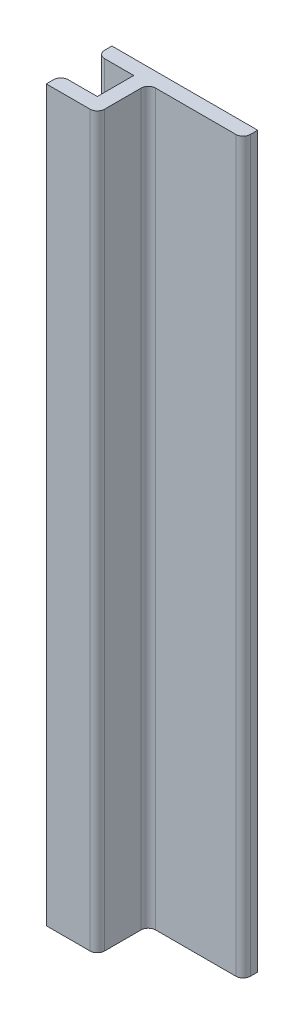
ISO-10303-21;
HEADER;
FILE_DESCRIPTION(('STEP AP214'),'2;1');
FILE_NAME('part.step','',(''),(''),'','','');
FILE_SCHEMA(('AUTOMOTIVE_DESIGN { 1 0 10303 214 1 1 1 1 }'));
ENDSEC;
DATA;
#1=APPLICATION_CONTEXT('core data for automotive mechanical design processes');
#2=APPLICATION_PROTOCOL_DEFINITION('international standard','automotive_design',2000,#1);
#3=PRODUCT_CONTEXT('',#1,'mechanical');
#4=PRODUCT('Part','Part','',(#3));
#5=PRODUCT_RELATED_PRODUCT_CATEGORY('part','',(#4));
#6=PRODUCT_DEFINITION_FORMATION('','',#4);
#7=PRODUCT_DEFINITION_CONTEXT('part definition',#1,'design');
#8=PRODUCT_DEFINITION('design','',#6,#7);
#9=PRODUCT_DEFINITION_SHAPE('','',#8);
#10=(LENGTH_UNIT() NAMED_UNIT(*) SI_UNIT(.MILLI.,.METRE.));
#11=(NAMED_UNIT(*) PLANE_ANGLE_UNIT() SI_UNIT($,.RADIAN.));
#12=(NAMED_UNIT(*) SI_UNIT($,.STERADIAN.) SOLID_ANGLE_UNIT());
#13=UNCERTAINTY_MEASURE_WITH_UNIT(LENGTH_MEASURE(1.E-05),#10,'distance_accuracy_value','');
#14=(GEOMETRIC_REPRESENTATION_CONTEXT(3) GLOBAL_UNCERTAINTY_ASSIGNED_CONTEXT((#13)) GLOBAL_UNIT_ASSIGNED_CONTEXT((#10,
#11,#12)) REPRESENTATION_CONTEXT('',''));
#15=CARTESIAN_POINT('',(0.,0.,0.));
#16=DIRECTION('',(0.,0.,1.));
#17=DIRECTION('',(1.,0.,0.));
#18=AXIS2_PLACEMENT_3D('',#15,#16,#17);
#19=CARTESIAN_POINT('',(0.,100.,2.));
#20=DIRECTION('',(1.,0.,0.));
#21=DIRECTION('',(0.,0.,-1.));
#22=AXIS2_PLACEMENT_3D('',#19,#20,#21);
#23=PLANE('',#22);
#24=DIRECTION('',(0.,0.,1.));
#25=VECTOR('',#24,1.);
#26=CARTESIAN_POINT('',(0.,0.,2.));
#27=LINE('',#26,#25);
#28=CARTESIAN_POINT('',(0.,0.,0.));
#29=VERTEX_POINT('',#28);
#30=CARTESIAN_POINT('',(0.,0.,1.));
#31=VERTEX_POINT('',#30);
#32=EDGE_CURVE('E187',#29,#31,#27,.T.);
#33=ORIENTED_EDGE('',*,*,#32,.T.);
#34=DIRECTION('',(0.,-1.,0.));
#35=VECTOR('',#34,1.);
#36=CARTESIAN_POINT('',(0.,100.,1.));
#37=LINE('',#36,#35);
#38=CARTESIAN_POINT('',(0.,100.,1.));
#39=VERTEX_POINT('',#38);
#40=EDGE_CURVE('E252',#31,#39,#37,.F.);
#41=ORIENTED_EDGE('',*,*,#40,.T.);
#42=DIRECTION('',(0.,0.,1.));
#43=VECTOR('',#42,1.);
#44=CARTESIAN_POINT('',(0.,100.,2.));
#45=LINE('',#44,#43);
#46=CARTESIAN_POINT('',(0.,100.,0.));
#47=VERTEX_POINT('',#46);
#48=EDGE_CURVE('E153',#47,#39,#45,.T.);
#49=ORIENTED_EDGE('',*,*,#48,.F.);
#50=DIRECTION('',(0.,-1.,0.));
#51=VECTOR('',#50,1.);
#52=CARTESIAN_POINT('',(0.,100.,0.));
#53=LINE('',#52,#51);
#54=EDGE_CURVE('E186',#47,#29,#53,.T.);
#55=ORIENTED_EDGE('',*,*,#54,.T.);
#56=EDGE_LOOP('',(#33,#41,#49,#55));
#57=FACE_BOUND('',#56,.T.);
#58=ADVANCED_FACE('F33',(#57),#23,.F.);
#59=CARTESIAN_POINT('',(5.,100.,2.));
#60=DIRECTION('',(0.,0.,-1.));
#61=DIRECTION('',(-1.,0.,0.));
#62=AXIS2_PLACEMENT_3D('',#59,#60,#61);
#63=PLANE('',#62);
#64=DIRECTION('',(1.,0.,0.));
#65=VECTOR('',#64,1.);
#66=CARTESIAN_POINT('',(5.,100.,2.));
#67=LINE('',#66,#65);
#68=CARTESIAN_POINT('',(1.,100.,2.));
#69=VERTEX_POINT('',#68);
#70=CARTESIAN_POINT('',(5.,100.,2.));
#71=VERTEX_POINT('',#70);
#72=EDGE_CURVE('E140',#69,#71,#67,.T.);
#73=ORIENTED_EDGE('',*,*,#72,.F.);
#74=DIRECTION('',(0.,-1.,0.));
#75=VECTOR('',#74,1.);
#76=CARTESIAN_POINT('',(1.,100.,2.));
#77=LINE('',#76,#75);
#78=CARTESIAN_POINT('',(1.,0.,2.));
#79=VERTEX_POINT('',#78);
#80=EDGE_CURVE('E250',#69,#79,#77,.T.);
#81=ORIENTED_EDGE('',*,*,#80,.T.);
#82=DIRECTION('',(1.,0.,0.));
#83=VECTOR('',#82,1.);
#84=CARTESIAN_POINT('',(5.,0.,2.));
#85=LINE('',#84,#83);
#86=CARTESIAN_POINT('',(5.,0.,2.));
#87=VERTEX_POINT('',#86);
#88=EDGE_CURVE('E159',#79,#87,#85,.T.);
#89=ORIENTED_EDGE('',*,*,#88,.T.);
#90=DIRECTION('',(0.,-1.,0.));
#91=VECTOR('',#90,1.);
#92=CARTESIAN_POINT('',(5.,100.,2.));
#93=LINE('',#92,#91);
#94=EDGE_CURVE('E156',#71,#87,#93,.T.);
#95=ORIENTED_EDGE('',*,*,#94,.F.);
#96=EDGE_LOOP('',(#73,#81,#89,#95));
#97=FACE_BOUND('',#96,.T.);
#98=ADVANCED_FACE('F157',(#97),#63,.F.);
#99=CARTESIAN_POINT('',(5.,100.,7.));
#100=DIRECTION('',(1.,0.,0.));
#101=DIRECTION('',(0.,0.,-1.));
#102=AXIS2_PLACEMENT_3D('',#99,#100,#101);
#103=PLANE('',#102);
#104=DIRECTION('',(0.,0.,1.));
#105=VECTOR('',#104,1.);
#106=CARTESIAN_POINT('',(5.,0.,7.));
#107=LINE('',#106,#105);
#108=CARTESIAN_POINT('',(5.,0.,7.));
#109=VERTEX_POINT('',#108);
#110=EDGE_CURVE('E191',#87,#109,#107,.T.);
#111=ORIENTED_EDGE('',*,*,#110,.T.);
#112=DIRECTION('',(0.,-1.,0.));
#113=VECTOR('',#112,1.);
#114=CARTESIAN_POINT('',(5.,100.,7.));
#115=LINE('',#114,#113);
#116=CARTESIAN_POINT('',(5.,100.,7.));
#117=VERTEX_POINT('',#116);
#118=EDGE_CURVE('E163',#117,#109,#115,.T.);
#119=ORIENTED_EDGE('',*,*,#118,.F.);
#120=DIRECTION('',(0.,0.,1.));
#121=VECTOR('',#120,1.);
#122=CARTESIAN_POINT('',(5.,100.,7.));
#123=LINE('',#122,#121);
#124=EDGE_CURVE('E145',#71,#117,#123,.T.);
#125=ORIENTED_EDGE('',*,*,#124,.F.);
#126=ORIENTED_EDGE('',*,*,#94,.T.);
#127=EDGE_LOOP('',(#111,#119,#125,#126));
#128=FACE_BOUND('',#127,.T.);
#129=ADVANCED_FACE('F165',(#128),#103,.F.);
#130=CARTESIAN_POINT('',(0.,100.,7.));
#131=DIRECTION('',(0.,0.,1.));
#132=DIRECTION('',(1.,0.,0.));
#133=AXIS2_PLACEMENT_3D('',#130,#131,#132);
#134=PLANE('',#133);
#135=DIRECTION('',(-1.,0.,0.));
#136=VECTOR('',#135,1.);
#137=CARTESIAN_POINT('',(0.,0.,7.));
#138=LINE('',#137,#136);
#139=CARTESIAN_POINT('',(1.,0.,7.));
#140=VERTEX_POINT('',#139);
#141=EDGE_CURVE('E193',#109,#140,#138,.T.);
#142=ORIENTED_EDGE('',*,*,#141,.T.);
#143=DIRECTION('',(0.,-1.,0.));
#144=VECTOR('',#143,1.);
#145=CARTESIAN_POINT('',(1.,100.,7.));
#146=LINE('',#145,#144);
#147=CARTESIAN_POINT('',(1.,100.,7.));
#148=VERTEX_POINT('',#147);
#149=EDGE_CURVE('E248',#140,#148,#146,.F.);
#150=ORIENTED_EDGE('',*,*,#149,.T.);
#151=DIRECTION('',(-1.,0.,0.));
#152=VECTOR('',#151,1.);
#153=CARTESIAN_POINT('',(0.,100.,7.));
#154=LINE('',#153,#152);
#155=EDGE_CURVE('E168',#117,#148,#154,.T.);
#156=ORIENTED_EDGE('',*,*,#155,.F.);
#157=ORIENTED_EDGE('',*,*,#118,.T.);
#158=EDGE_LOOP('',(#142,#150,#156,#157));
#159=FACE_BOUND('',#158,.T.);
#160=ADVANCED_FACE('F293',(#159),#134,.F.);
#161=CARTESIAN_POINT('',(0.,100.,9.));
#162=DIRECTION('',(1.,0.,0.));
#163=DIRECTION('',(0.,0.,-1.));
#164=AXIS2_PLACEMENT_3D('',#161,#162,#163);
#165=PLANE('',#164);
#166=DIRECTION('',(0.,0.,1.));
#167=VECTOR('',#166,1.);
#168=CARTESIAN_POINT('',(0.,100.,9.));
#169=LINE('',#168,#167);
#170=CARTESIAN_POINT('',(0.,100.,8.));
#171=VERTEX_POINT('',#170);
#172=CARTESIAN_POINT('',(0.,100.,9.));
#173=VERTEX_POINT('',#172);
#174=EDGE_CURVE('E170',#171,#173,#169,.T.);
#175=ORIENTED_EDGE('',*,*,#174,.F.);
#176=DIRECTION('',(0.,-1.,0.));
#177=VECTOR('',#176,1.);
#178=CARTESIAN_POINT('',(0.,100.,8.));
#179=LINE('',#178,#177);
#180=CARTESIAN_POINT('',(0.,0.,8.));
#181=VERTEX_POINT('',#180);
#182=EDGE_CURVE('E245',#171,#181,#179,.T.);
#183=ORIENTED_EDGE('',*,*,#182,.T.);
#184=DIRECTION('',(0.,0.,1.));
#185=VECTOR('',#184,1.);
#186=CARTESIAN_POINT('',(0.,0.,9.));
#187=LINE('',#186,#185);
#188=CARTESIAN_POINT('',(0.,0.,9.));
#189=VERTEX_POINT('',#188);
#190=EDGE_CURVE('E196',#181,#189,#187,.T.);
#191=ORIENTED_EDGE('',*,*,#190,.T.);
#192=DIRECTION('',(0.,-1.,0.));
#193=VECTOR('',#192,1.);
#194=CARTESIAN_POINT('',(0.,100.,9.));
#195=LINE('',#194,#193);
#196=EDGE_CURVE('E215',#173,#189,#195,.T.);
#197=ORIENTED_EDGE('',*,*,#196,.F.);
#198=EDGE_LOOP('',(#175,#183,#191,#197));
#199=FACE_BOUND('',#198,.T.);
#200=ADVANCED_FACE('F300',(#199),#165,.F.);
#201=CARTESIAN_POINT('',(7.,100.,9.));
#202=DIRECTION('',(0.,0.,-1.));
#203=DIRECTION('',(-1.,0.,0.));
#204=AXIS2_PLACEMENT_3D('',#201,#202,#203);
#205=PLANE('',#204);
#206=DIRECTION('',(1.,0.,0.));
#207=VECTOR('',#206,1.);
#208=CARTESIAN_POINT('',(7.,0.,9.));
#209=LINE('',#208,#207);
#210=CARTESIAN_POINT('',(6.,0.,9.));
#211=VERTEX_POINT('',#210);
#212=EDGE_CURVE('E198',#189,#211,#209,.T.);
#213=ORIENTED_EDGE('',*,*,#212,.T.);
#214=DIRECTION('',(0.,-1.,0.));
#215=VECTOR('',#214,1.);
#216=CARTESIAN_POINT('',(6.,100.,9.));
#217=LINE('',#216,#215);
#218=CARTESIAN_POINT('',(6.,100.,9.));
#219=VERTEX_POINT('',#218);
#220=EDGE_CURVE('E48',#211,#219,#217,.F.);
#221=ORIENTED_EDGE('',*,*,#220,.T.);
#222=DIRECTION('',(1.,0.,0.));
#223=VECTOR('',#222,1.);
#224=CARTESIAN_POINT('',(7.,100.,9.));
#225=LINE('',#224,#223);
#226=EDGE_CURVE('E175',#173,#219,#225,.T.);
#227=ORIENTED_EDGE('',*,*,#226,.F.);
#228=ORIENTED_EDGE('',*,*,#196,.T.);
#229=EDGE_LOOP('',(#213,#221,#227,#228));
#230=FACE_BOUND('',#229,.T.);
#231=ADVANCED_FACE('F303',(#230),#205,.F.);
#232=CARTESIAN_POINT('',(7.,100.,2.));
#233=DIRECTION('',(-1.,0.,0.));
#234=DIRECTION('',(0.,0.,1.));
#235=AXIS2_PLACEMENT_3D('',#232,#233,#234);
#236=PLANE('',#235);
#237=DIRECTION('',(0.,0.,-1.));
#238=VECTOR('',#237,1.);
#239=CARTESIAN_POINT('',(7.,0.,2.));
#240=LINE('',#239,#238);
#241=CARTESIAN_POINT('',(7.,0.,8.));
#242=VERTEX_POINT('',#241);
#243=CARTESIAN_POINT('',(7.,0.,3.));
#244=VERTEX_POINT('',#243);
#245=EDGE_CURVE('E200',#242,#244,#240,.T.);
#246=ORIENTED_EDGE('',*,*,#245,.T.);
#247=DIRECTION('',(0.,-1.,0.));
#248=VECTOR('',#247,1.);
#249=CARTESIAN_POINT('',(7.,100.,3.));
#250=LINE('',#249,#248);
#251=CARTESIAN_POINT('',(7.,100.,3.));
#252=VERTEX_POINT('',#251);
#253=EDGE_CURVE('E226',#244,#252,#250,.F.);
#254=ORIENTED_EDGE('',*,*,#253,.T.);
#255=DIRECTION('',(0.,0.,-1.));
#256=VECTOR('',#255,1.);
#257=CARTESIAN_POINT('',(7.,100.,2.));
#258=LINE('',#257,#256);
#259=CARTESIAN_POINT('',(7.,100.,8.));
#260=VERTEX_POINT('',#259);
#261=EDGE_CURVE('E177',#260,#252,#258,.T.);
#262=ORIENTED_EDGE('',*,*,#261,.F.);
#263=DIRECTION('',(0.,-1.,0.));
#264=VECTOR('',#263,1.);
#265=CARTESIAN_POINT('',(7.,100.,8.));
#266=LINE('',#265,#264);
#267=EDGE_CURVE('E223',#260,#242,#266,.T.);
#268=ORIENTED_EDGE('',*,*,#267,.T.);
#269=EDGE_LOOP('',(#246,#254,#262,#268));
#270=FACE_BOUND('',#269,.T.);
#271=ADVANCED_FACE('F263',(#270),#236,.F.);
#272=CARTESIAN_POINT('',(20.,100.,2.));
#273=DIRECTION('',(0.,0.,-1.));
#274=DIRECTION('',(-1.,0.,0.));
#275=AXIS2_PLACEMENT_3D('',#272,#273,#274);
#276=PLANE('',#275);
#277=DIRECTION('',(1.,0.,0.));
#278=VECTOR('',#277,1.);
#279=CARTESIAN_POINT('',(20.,100.,2.));
#280=LINE('',#279,#278);
#281=CARTESIAN_POINT('',(8.,100.,2.));
#282=VERTEX_POINT('',#281);
#283=CARTESIAN_POINT('',(19.,100.,2.));
#284=VERTEX_POINT('',#283);
#285=EDGE_CURVE('E180',#282,#284,#280,.T.);
#286=ORIENTED_EDGE('',*,*,#285,.F.);
#287=DIRECTION('',(0.,-1.,0.));
#288=VECTOR('',#287,1.);
#289=CARTESIAN_POINT('',(8.,0.,2.));
#290=LINE('',#289,#288);
#291=CARTESIAN_POINT('',(8.,0.,2.));
#292=VERTEX_POINT('',#291);
#293=EDGE_CURVE('E220',#282,#292,#290,.T.);
#294=ORIENTED_EDGE('',*,*,#293,.T.);
#295=DIRECTION('',(1.,0.,0.));
#296=VECTOR('',#295,1.);
#297=CARTESIAN_POINT('',(20.,0.,2.));
#298=LINE('',#297,#296);
#299=CARTESIAN_POINT('',(19.,0.,2.));
#300=VERTEX_POINT('',#299);
#301=EDGE_CURVE('E203',#292,#300,#298,.T.);
#302=ORIENTED_EDGE('',*,*,#301,.T.);
#303=DIRECTION('',(0.,-1.,0.));
#304=VECTOR('',#303,1.);
#305=CARTESIAN_POINT('',(19.,100.,2.));
#306=LINE('',#305,#304);
#307=EDGE_CURVE('E162',#300,#284,#306,.F.);
#308=ORIENTED_EDGE('',*,*,#307,.T.);
#309=EDGE_LOOP('',(#286,#294,#302,#308));
#310=FACE_BOUND('',#309,.T.);
#311=ADVANCED_FACE('F271',(#310),#276,.F.);
#312=CARTESIAN_POINT('',(20.,100.,0.));
#313=DIRECTION('',(-1.,0.,0.));
#314=DIRECTION('',(0.,0.,1.));
#315=AXIS2_PLACEMENT_3D('',#312,#313,#314);
#316=PLANE('',#315);
#317=DIRECTION('',(0.,0.,-1.));
#318=VECTOR('',#317,1.);
#319=CARTESIAN_POINT('',(20.,100.,0.));
#320=LINE('',#319,#318);
#321=CARTESIAN_POINT('',(20.,100.,1.));
#322=VERTEX_POINT('',#321);
#323=CARTESIAN_POINT('',(20.,100.,0.));
#324=VERTEX_POINT('',#323);
#325=EDGE_CURVE('E182',#322,#324,#320,.T.);
#326=ORIENTED_EDGE('',*,*,#325,.F.);
#327=DIRECTION('',(0.,-1.,0.));
#328=VECTOR('',#327,1.);
#329=CARTESIAN_POINT('',(20.,100.,1.));
#330=LINE('',#329,#328);
#331=CARTESIAN_POINT('',(20.,0.,1.));
#332=VERTEX_POINT('',#331);
#333=EDGE_CURVE('E228',#322,#332,#330,.T.);
#334=ORIENTED_EDGE('',*,*,#333,.T.);
#335=DIRECTION('',(0.,0.,-1.));
#336=VECTOR('',#335,1.);
#337=CARTESIAN_POINT('',(20.,0.,0.));
#338=LINE('',#337,#336);
#339=CARTESIAN_POINT('',(20.,0.,0.));
#340=VERTEX_POINT('',#339);
#341=EDGE_CURVE('E206',#332,#340,#338,.T.);
#342=ORIENTED_EDGE('',*,*,#341,.T.);
#343=DIRECTION('',(0.,-1.,0.));
#344=VECTOR('',#343,1.);
#345=CARTESIAN_POINT('',(20.,100.,0.));
#346=LINE('',#345,#344);
#347=EDGE_CURVE('E212',#324,#340,#346,.T.);
#348=ORIENTED_EDGE('',*,*,#347,.F.);
#349=EDGE_LOOP('',(#326,#334,#342,#348));
#350=FACE_BOUND('',#349,.T.);
#351=ADVANCED_FACE('F279',(#350),#316,.F.);
#352=CARTESIAN_POINT('',(0.,100.,0.));
#353=DIRECTION('',(0.,0.,1.));
#354=DIRECTION('',(1.,0.,0.));
#355=AXIS2_PLACEMENT_3D('',#352,#353,#354);
#356=PLANE('',#355);
#357=DIRECTION('',(-1.,0.,0.));
#358=VECTOR('',#357,1.);
#359=CARTESIAN_POINT('',(0.,0.,0.));
#360=LINE('',#359,#358);
#361=EDGE_CURVE('E208',#340,#29,#360,.T.);
#362=ORIENTED_EDGE('',*,*,#361,.T.);
#363=ORIENTED_EDGE('',*,*,#54,.F.);
#364=DIRECTION('',(-1.,0.,0.));
#365=VECTOR('',#364,1.);
#366=CARTESIAN_POINT('',(0.,100.,0.));
#367=LINE('',#366,#365);
#368=EDGE_CURVE('E184',#324,#47,#367,.T.);
#369=ORIENTED_EDGE('',*,*,#368,.F.);
#370=ORIENTED_EDGE('',*,*,#347,.T.);
#371=EDGE_LOOP('',(#362,#363,#369,#370));
#372=FACE_BOUND('',#371,.T.);
#373=ADVANCED_FACE('F284',(#372),#356,.F.);
#374=CARTESIAN_POINT('',(0.,100.,0.));
#375=DIRECTION('',(0.,-1.,0.));
#376=DIRECTION('',(0.,0.,-1.));
#377=AXIS2_PLACEMENT_3D('',#374,#375,#376);
#378=PLANE('',#377);
#379=ORIENTED_EDGE('',*,*,#285,.T.);
#380=CARTESIAN_POINT('',(19.,100.,1.));
#381=DIRECTION('',(0.,-1.,0.));
#382=DIRECTION('',(0.,0.,-1.));
#383=AXIS2_PLACEMENT_3D('',#380,#381,#382);
#384=CIRCLE('',#383,1.);
#385=EDGE_CURVE('E243',#284,#322,#384,.F.);
#386=ORIENTED_EDGE('',*,*,#385,.T.);
#387=ORIENTED_EDGE('',*,*,#325,.T.);
#388=ORIENTED_EDGE('',*,*,#368,.T.);
#389=ORIENTED_EDGE('',*,*,#48,.T.);
#390=CARTESIAN_POINT('',(1.,100.,1.));
#391=DIRECTION('',(0.,-1.,0.));
#392=DIRECTION('',(0.,0.,-1.));
#393=AXIS2_PLACEMENT_3D('',#390,#391,#392);
#394=CIRCLE('',#393,1.);
#395=EDGE_CURVE('E149',#39,#69,#394,.F.);
#396=ORIENTED_EDGE('',*,*,#395,.T.);
#397=ORIENTED_EDGE('',*,*,#72,.T.);
#398=ORIENTED_EDGE('',*,*,#124,.T.);
#399=ORIENTED_EDGE('',*,*,#155,.T.);
#400=CARTESIAN_POINT('',(1.,100.,8.));
#401=DIRECTION('',(0.,-1.,0.));
#402=DIRECTION('',(0.,0.,-1.));
#403=AXIS2_PLACEMENT_3D('',#400,#401,#402);
#404=CIRCLE('',#403,1.);
#405=EDGE_CURVE('E56',#148,#171,#404,.F.);
#406=ORIENTED_EDGE('',*,*,#405,.T.);
#407=ORIENTED_EDGE('',*,*,#174,.T.);
#408=ORIENTED_EDGE('',*,*,#226,.T.);
#409=CARTESIAN_POINT('',(6.,100.,8.));
#410=DIRECTION('',(0.,-1.,0.));
#411=DIRECTION('',(0.,0.,-1.));
#412=AXIS2_PLACEMENT_3D('',#409,#410,#411);
#413=CIRCLE('',#412,1.);
#414=EDGE_CURVE('E239',#219,#260,#413,.F.);
#415=ORIENTED_EDGE('',*,*,#414,.T.);
#416=ORIENTED_EDGE('',*,*,#261,.T.);
#417=CARTESIAN_POINT('',(8.,100.,3.));
#418=DIRECTION('',(0.,-1.,0.));
#419=DIRECTION('',(0.,0.,-1.));
#420=AXIS2_PLACEMENT_3D('',#417,#418,#419);
#421=CIRCLE('',#420,1.);
#422=EDGE_CURVE('E11',#252,#282,#421,.T.);
#423=ORIENTED_EDGE('',*,*,#422,.T.);
#424=EDGE_LOOP('',(#379,#386,#387,#388,#389,#396,#397,#398,#399,#406,#407,#408,#415,#416,#423));
#425=FACE_BOUND('',#424,.T.);
#426=ADVANCED_FACE('F143',(#425),#378,.F.);
#427=CARTESIAN_POINT('',(0.,0.,0.));
#428=DIRECTION('',(0.,-1.,0.));
#429=DIRECTION('',(0.,0.,-1.));
#430=AXIS2_PLACEMENT_3D('',#427,#428,#429);
#431=PLANE('',#430);
#432=ORIENTED_EDGE('',*,*,#341,.F.);
#433=CARTESIAN_POINT('',(19.,0.,1.));
#434=DIRECTION('',(0.,-1.,0.));
#435=DIRECTION('',(0.,0.,-1.));
#436=AXIS2_PLACEMENT_3D('',#433,#434,#435);
#437=CIRCLE('',#436,1.);
#438=EDGE_CURVE('E237',#332,#300,#437,.T.);
#439=ORIENTED_EDGE('',*,*,#438,.T.);
#440=ORIENTED_EDGE('',*,*,#301,.F.);
#441=CARTESIAN_POINT('',(8.,0.,3.));
#442=DIRECTION('',(0.,-1.,0.));
#443=DIRECTION('',(0.,0.,-1.));
#444=AXIS2_PLACEMENT_3D('',#441,#442,#443);
#445=CIRCLE('',#444,1.);
#446=EDGE_CURVE('E41',#292,#244,#445,.F.);
#447=ORIENTED_EDGE('',*,*,#446,.T.);
#448=ORIENTED_EDGE('',*,*,#245,.F.);
#449=CARTESIAN_POINT('',(6.,0.,8.));
#450=DIRECTION('',(0.,-1.,0.));
#451=DIRECTION('',(0.,0.,-1.));
#452=AXIS2_PLACEMENT_3D('',#449,#450,#451);
#453=CIRCLE('',#452,1.);
#454=EDGE_CURVE('E231',#242,#211,#453,.T.);
#455=ORIENTED_EDGE('',*,*,#454,.T.);
#456=ORIENTED_EDGE('',*,*,#212,.F.);
#457=ORIENTED_EDGE('',*,*,#190,.F.);
#458=CARTESIAN_POINT('',(1.,0.,8.));
#459=DIRECTION('',(0.,-1.,0.));
#460=DIRECTION('',(0.,0.,-1.));
#461=AXIS2_PLACEMENT_3D('',#458,#459,#460);
#462=CIRCLE('',#461,1.);
#463=EDGE_CURVE('E235',#181,#140,#462,.T.);
#464=ORIENTED_EDGE('',*,*,#463,.T.);
#465=ORIENTED_EDGE('',*,*,#141,.F.);
#466=ORIENTED_EDGE('',*,*,#110,.F.);
#467=ORIENTED_EDGE('',*,*,#88,.F.);
#468=CARTESIAN_POINT('',(1.,0.,1.));
#469=DIRECTION('',(0.,-1.,0.));
#470=DIRECTION('',(0.,0.,-1.));
#471=AXIS2_PLACEMENT_3D('',#468,#469,#470);
#472=CIRCLE('',#471,1.);
#473=EDGE_CURVE('E233',#79,#31,#472,.T.);
#474=ORIENTED_EDGE('',*,*,#473,.T.);
#475=ORIENTED_EDGE('',*,*,#32,.F.);
#476=ORIENTED_EDGE('',*,*,#361,.F.);
#477=EDGE_LOOP('',(#432,#439,#440,#447,#448,#455,#456,#457,#464,#465,#466,#467,#474,#475,#476));
#478=FACE_BOUND('',#477,.T.);
#479=ADVANCED_FACE('F258',(#478),#431,.T.);
#480=CARTESIAN_POINT('',(8.,100.,3.));
#481=DIRECTION('',(0.,1.,0.));
#482=DIRECTION('',(0.,0.,1.));
#483=AXIS2_PLACEMENT_3D('',#480,#481,#482);
#484=CYLINDRICAL_SURFACE('',#483,1.);
#485=ORIENTED_EDGE('',*,*,#422,.F.);
#486=ORIENTED_EDGE('',*,*,#253,.F.);
#487=ORIENTED_EDGE('',*,*,#446,.F.);
#488=ORIENTED_EDGE('',*,*,#293,.F.);
#489=EDGE_LOOP('',(#485,#486,#487,#488));
#490=FACE_BOUND('',#489,.T.);
#491=ADVANCED_FACE('F267',(#490),#484,.F.);
#492=CARTESIAN_POINT('',(19.,100.,1.));
#493=DIRECTION('',(0.,-1.,0.));
#494=DIRECTION('',(0.,0.,-1.));
#495=AXIS2_PLACEMENT_3D('',#492,#493,#494);
#496=CYLINDRICAL_SURFACE('',#495,1.);
#497=ORIENTED_EDGE('',*,*,#385,.F.);
#498=ORIENTED_EDGE('',*,*,#307,.F.);
#499=ORIENTED_EDGE('',*,*,#438,.F.);
#500=ORIENTED_EDGE('',*,*,#333,.F.);
#501=EDGE_LOOP('',(#497,#498,#499,#500));
#502=FACE_BOUND('',#501,.T.);
#503=ADVANCED_FACE('F274',(#502),#496,.T.);
#504=CARTESIAN_POINT('',(1.,100.,8.));
#505=DIRECTION('',(0.,-1.,0.));
#506=DIRECTION('',(0.,0.,-1.));
#507=AXIS2_PLACEMENT_3D('',#504,#505,#506);
#508=CYLINDRICAL_SURFACE('',#507,1.);
#509=ORIENTED_EDGE('',*,*,#405,.F.);
#510=ORIENTED_EDGE('',*,*,#149,.F.);
#511=ORIENTED_EDGE('',*,*,#463,.F.);
#512=ORIENTED_EDGE('',*,*,#182,.F.);
#513=EDGE_LOOP('',(#509,#510,#511,#512));
#514=FACE_BOUND('',#513,.T.);
#515=ADVANCED_FACE('F297',(#514),#508,.T.);
#516=CARTESIAN_POINT('',(1.,100.,1.));
#517=DIRECTION('',(0.,-1.,0.));
#518=DIRECTION('',(0.,0.,-1.));
#519=AXIS2_PLACEMENT_3D('',#516,#517,#518);
#520=CYLINDRICAL_SURFACE('',#519,1.);
#521=ORIENTED_EDGE('',*,*,#395,.F.);
#522=ORIENTED_EDGE('',*,*,#40,.F.);
#523=ORIENTED_EDGE('',*,*,#473,.F.);
#524=ORIENTED_EDGE('',*,*,#80,.F.);
#525=EDGE_LOOP('',(#521,#522,#523,#524));
#526=FACE_BOUND('',#525,.T.);
#527=ADVANCED_FACE('F289',(#526),#520,.T.);
#528=CARTESIAN_POINT('',(6.,100.,8.));
#529=DIRECTION('',(0.,-1.,0.));
#530=DIRECTION('',(0.,0.,-1.));
#531=AXIS2_PLACEMENT_3D('',#528,#529,#530);
#532=CYLINDRICAL_SURFACE('',#531,1.);
#533=ORIENTED_EDGE('',*,*,#414,.F.);
#534=ORIENTED_EDGE('',*,*,#220,.F.);
#535=ORIENTED_EDGE('',*,*,#454,.F.);
#536=ORIENTED_EDGE('',*,*,#267,.F.);
#537=EDGE_LOOP('',(#533,#534,#535,#536));
#538=FACE_BOUND('',#537,.T.);
#539=ADVANCED_FACE('F35',(#538),#532,.T.);
#540=CLOSED_SHELL('',(#58,#98,#129,#160,#200,#231,#271,#311,#351,#373,#426,#479,#491,#503,#515,
#527,#539));
#541=MANIFOLD_SOLID_BREP('B2',#540);
#542=ADVANCED_BREP_SHAPE_REPRESENTATION('',(#18,#541),#14);
#543=SHAPE_DEFINITION_REPRESENTATION(#9,#542);
ENDSEC;
END-ISO-10303-21;
